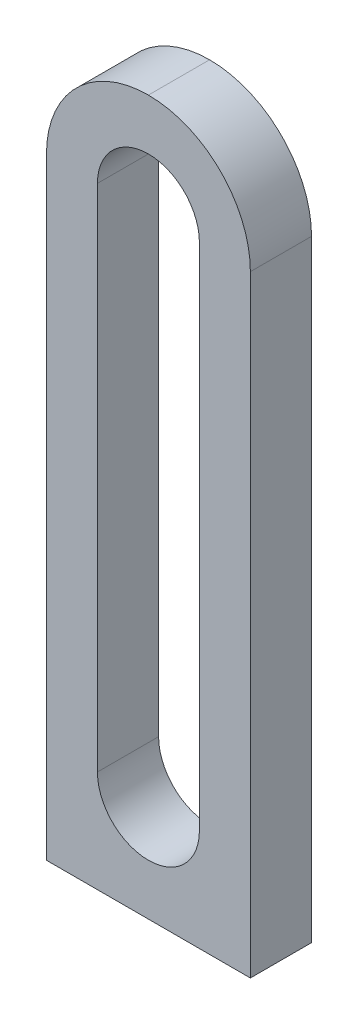
ISO-10303-21;
HEADER;
FILE_DESCRIPTION(('STEP AP214'),'2;1');
FILE_NAME('part.step','',(''),(''),'','','');
FILE_SCHEMA(('AUTOMOTIVE_DESIGN { 1 0 10303 214 1 1 1 1 }'));
ENDSEC;
DATA;
#1=APPLICATION_CONTEXT('core data for automotive mechanical design processes');
#2=APPLICATION_PROTOCOL_DEFINITION('international standard','automotive_design',2000,#1);
#3=PRODUCT_CONTEXT('',#1,'mechanical');
#4=PRODUCT('Part','Part','',(#3));
#5=PRODUCT_RELATED_PRODUCT_CATEGORY('part','',(#4));
#6=PRODUCT_DEFINITION_FORMATION('','',#4);
#7=PRODUCT_DEFINITION_CONTEXT('part definition',#1,'design');
#8=PRODUCT_DEFINITION('design','',#6,#7);
#9=PRODUCT_DEFINITION_SHAPE('','',#8);
#10=(LENGTH_UNIT() NAMED_UNIT(*) SI_UNIT(.MILLI.,.METRE.));
#11=(NAMED_UNIT(*) PLANE_ANGLE_UNIT() SI_UNIT($,.RADIAN.));
#12=(NAMED_UNIT(*) SI_UNIT($,.STERADIAN.) SOLID_ANGLE_UNIT());
#13=UNCERTAINTY_MEASURE_WITH_UNIT(LENGTH_MEASURE(1.E-05),#10,'distance_accuracy_value','');
#14=(GEOMETRIC_REPRESENTATION_CONTEXT(3) GLOBAL_UNCERTAINTY_ASSIGNED_CONTEXT((#13)) GLOBAL_UNIT_ASSIGNED_CONTEXT((#10,
#11,#12)) REPRESENTATION_CONTEXT('',''));
#15=CARTESIAN_POINT('',(0.,0.,0.));
#16=DIRECTION('',(0.,0.,1.));
#17=DIRECTION('',(1.,0.,0.));
#18=AXIS2_PLACEMENT_3D('',#15,#16,#17);
#19=CARTESIAN_POINT('',(4.99999999999999,-17.5,-3.));
#20=DIRECTION('',(1.,0.,0.));
#21=DIRECTION('',(0.,0.,-1.));
#22=AXIS2_PLACEMENT_3D('',#19,#20,#21);
#23=PLANE('',#22);
#24=DIRECTION('',(0.,1.,0.));
#25=VECTOR('',#24,1.);
#26=CARTESIAN_POINT('',(4.99999999999999,-17.5,-3.));
#27=LINE('',#26,#25);
#28=CARTESIAN_POINT('',(4.99999999999999,-17.5,-3.));
#29=VERTEX_POINT('',#28);
#30=CARTESIAN_POINT('',(4.99999999999999,12.5,-3.));
#31=VERTEX_POINT('',#30);
#32=EDGE_CURVE('E149',#29,#31,#27,.T.);
#33=ORIENTED_EDGE('',*,*,#32,.T.);
#34=DIRECTION('',(0.,0.,1.));
#35=VECTOR('',#34,1.);
#36=CARTESIAN_POINT('',(4.99999999999999,12.5,-3.));
#37=LINE('',#36,#35);
#38=CARTESIAN_POINT('',(4.99999999999999,12.5,0.));
#39=VERTEX_POINT('',#38);
#40=EDGE_CURVE('E11',#31,#39,#37,.T.);
#41=ORIENTED_EDGE('',*,*,#40,.T.);
#42=DIRECTION('',(0.,1.,0.));
#43=VECTOR('',#42,1.);
#44=CARTESIAN_POINT('',(4.99999999999999,-17.5,0.));
#45=LINE('',#44,#43);
#46=CARTESIAN_POINT('',(4.99999999999999,-17.5,0.));
#47=VERTEX_POINT('',#46);
#48=EDGE_CURVE('E145',#47,#39,#45,.T.);
#49=ORIENTED_EDGE('',*,*,#48,.F.);
#50=DIRECTION('',(0.,0.,1.));
#51=VECTOR('',#50,1.);
#52=CARTESIAN_POINT('',(4.99999999999999,-17.5,-3.));
#53=LINE('',#52,#51);
#54=EDGE_CURVE('E164',#29,#47,#53,.T.);
#55=ORIENTED_EDGE('',*,*,#54,.F.);
#56=EDGE_LOOP('',(#33,#41,#49,#55));
#57=FACE_BOUND('',#56,.T.);
#58=ADVANCED_FACE('F37',(#57),#23,.T.);
#59=CARTESIAN_POINT('',(-5.00000000000001,-17.5,-3.));
#60=DIRECTION('',(0.,-1.,0.));
#61=DIRECTION('',(0.,0.,-1.));
#62=AXIS2_PLACEMENT_3D('',#59,#60,#61);
#63=PLANE('',#62);
#64=DIRECTION('',(1.,0.,0.));
#65=VECTOR('',#64,1.);
#66=CARTESIAN_POINT('',(-5.00000000000001,-17.5,0.));
#67=LINE('',#66,#65);
#68=CARTESIAN_POINT('',(-5.00000000000001,-17.5,0.));
#69=VERTEX_POINT('',#68);
#70=EDGE_CURVE('E152',#69,#47,#67,.T.);
#71=ORIENTED_EDGE('',*,*,#70,.F.);
#72=DIRECTION('',(0.,0.,1.));
#73=VECTOR('',#72,1.);
#74=CARTESIAN_POINT('',(-5.00000000000001,-17.5,-3.));
#75=LINE('',#74,#73);
#76=CARTESIAN_POINT('',(-5.00000000000001,-17.5,-3.));
#77=VERTEX_POINT('',#76);
#78=EDGE_CURVE('E157',#77,#69,#75,.T.);
#79=ORIENTED_EDGE('',*,*,#78,.F.);
#80=DIRECTION('',(1.,0.,0.));
#81=VECTOR('',#80,1.);
#82=CARTESIAN_POINT('',(-5.00000000000001,-17.5,-3.));
#83=LINE('',#82,#81);
#84=EDGE_CURVE('E154',#77,#29,#83,.T.);
#85=ORIENTED_EDGE('',*,*,#84,.T.);
#86=ORIENTED_EDGE('',*,*,#54,.T.);
#87=EDGE_LOOP('',(#71,#79,#85,#86));
#88=FACE_BOUND('',#87,.T.);
#89=ADVANCED_FACE('F186',(#88),#63,.T.);
#90=CARTESIAN_POINT('',(-5.00000000000001,-17.5,-3.));
#91=DIRECTION('',(-1.,0.,0.));
#92=DIRECTION('',(0.,0.,1.));
#93=AXIS2_PLACEMENT_3D('',#90,#91,#92);
#94=PLANE('',#93);
#95=DIRECTION('',(0.,-1.,0.));
#96=VECTOR('',#95,1.);
#97=CARTESIAN_POINT('',(-5.00000000000001,-17.5,0.));
#98=LINE('',#97,#96);
#99=CARTESIAN_POINT('',(-5.00000000000001,12.5,0.));
#100=VERTEX_POINT('',#99);
#101=EDGE_CURVE('E160',#100,#69,#98,.T.);
#102=ORIENTED_EDGE('',*,*,#101,.F.);
#103=DIRECTION('',(0.,0.,1.));
#104=VECTOR('',#103,1.);
#105=CARTESIAN_POINT('',(-5.00000000000001,12.5,-3.));
#106=LINE('',#105,#104);
#107=CARTESIAN_POINT('',(-5.00000000000001,12.5,-3.));
#108=VERTEX_POINT('',#107);
#109=EDGE_CURVE('E172',#100,#108,#106,.F.);
#110=ORIENTED_EDGE('',*,*,#109,.T.);
#111=DIRECTION('',(0.,-1.,0.));
#112=VECTOR('',#111,1.);
#113=CARTESIAN_POINT('',(-5.00000000000001,-17.5,-3.));
#114=LINE('',#113,#112);
#115=EDGE_CURVE('E151',#108,#77,#114,.T.);
#116=ORIENTED_EDGE('',*,*,#115,.T.);
#117=ORIENTED_EDGE('',*,*,#78,.T.);
#118=EDGE_LOOP('',(#102,#110,#116,#117));
#119=FACE_BOUND('',#118,.T.);
#120=ADVANCED_FACE('F179',(#119),#94,.T.);
#121=CARTESIAN_POINT('',(0.,0.,-3.));
#122=DIRECTION('',(0.,0.,-1.));
#123=DIRECTION('',(-1.,0.,0.));
#124=AXIS2_PLACEMENT_3D('',#121,#122,#123);
#125=PLANE('',#124);
#126=CARTESIAN_POINT('',(0.,-12.5,-3.));
#127=DIRECTION('',(0.,0.,1.));
#128=DIRECTION('',(1.,0.,0.));
#129=AXIS2_PLACEMENT_3D('',#126,#127,#128);
#130=CIRCLE('',#129,2.5);
#131=CARTESIAN_POINT('',(-2.50000000000002,-12.5,-3.));
#132=VERTEX_POINT('',#131);
#133=CARTESIAN_POINT('',(2.49999999999999,-12.5,-3.));
#134=VERTEX_POINT('',#133);
#135=EDGE_CURVE('E110',#132,#134,#130,.T.);
#136=ORIENTED_EDGE('',*,*,#135,.T.);
#137=DIRECTION('',(0.,1.,0.));
#138=VECTOR('',#137,1.);
#139=CARTESIAN_POINT('',(2.49999999999999,-12.5,-3.));
#140=LINE('',#139,#138);
#141=CARTESIAN_POINT('',(2.49999999999999,12.5,-3.));
#142=VERTEX_POINT('',#141);
#143=EDGE_CURVE('E122',#134,#142,#140,.T.);
#144=ORIENTED_EDGE('',*,*,#143,.T.);
#145=CARTESIAN_POINT('',(0.,12.5,-3.));
#146=DIRECTION('',(0.,0.,1.));
#147=DIRECTION('',(1.,0.,0.));
#148=AXIS2_PLACEMENT_3D('',#145,#146,#147);
#149=CIRCLE('',#148,2.5);
#150=CARTESIAN_POINT('',(-2.50000000000002,12.5,-3.));
#151=VERTEX_POINT('',#150);
#152=EDGE_CURVE('E126',#142,#151,#149,.T.);
#153=ORIENTED_EDGE('',*,*,#152,.T.);
#154=DIRECTION('',(0.,-1.,0.));
#155=VECTOR('',#154,1.);
#156=CARTESIAN_POINT('',(-2.50000000000002,-12.5,-3.));
#157=LINE('',#156,#155);
#158=EDGE_CURVE('E118',#151,#132,#157,.T.);
#159=ORIENTED_EDGE('',*,*,#158,.T.);
#160=EDGE_LOOP('',(#136,#144,#153,#159));
#161=FACE_BOUND('',#160,.T.);
#162=ORIENTED_EDGE('',*,*,#115,.F.);
#163=CARTESIAN_POINT('',(0.,12.5,-3.));
#164=DIRECTION('',(0.,0.,-1.));
#165=DIRECTION('',(-1.,0.,0.));
#166=AXIS2_PLACEMENT_3D('',#163,#164,#165);
#167=CIRCLE('',#166,5.);
#168=CARTESIAN_POINT('',(0.,17.5,-3.));
#169=VERTEX_POINT('',#168);
#170=EDGE_CURVE('E46',#108,#169,#167,.T.);
#171=ORIENTED_EDGE('',*,*,#170,.T.);
#172=CARTESIAN_POINT('',(0.,12.5,-3.));
#173=DIRECTION('',(0.,0.,-1.));
#174=DIRECTION('',(-1.,0.,0.));
#175=AXIS2_PLACEMENT_3D('',#172,#173,#174);
#176=CIRCLE('',#175,5.);
#177=EDGE_CURVE('E56',#169,#31,#176,.T.);
#178=ORIENTED_EDGE('',*,*,#177,.T.);
#179=ORIENTED_EDGE('',*,*,#32,.F.);
#180=ORIENTED_EDGE('',*,*,#84,.F.);
#181=EDGE_LOOP('',(#162,#171,#178,#179,#180));
#182=FACE_BOUND('',#181,.T.);
#183=ADVANCED_FACE('F128',(#161,#182),#125,.T.);
#184=CARTESIAN_POINT('',(0.,0.,0.));
#185=DIRECTION('',(0.,0.,-1.));
#186=DIRECTION('',(-1.,0.,0.));
#187=AXIS2_PLACEMENT_3D('',#184,#185,#186);
#188=PLANE('',#187);
#189=DIRECTION('',(0.,1.,0.));
#190=VECTOR('',#189,1.);
#191=CARTESIAN_POINT('',(2.49999999999999,-12.5,0.));
#192=LINE('',#191,#190);
#193=CARTESIAN_POINT('',(2.49999999999999,-12.5,0.));
#194=VERTEX_POINT('',#193);
#195=CARTESIAN_POINT('',(2.49999999999999,12.5,0.));
#196=VERTEX_POINT('',#195);
#197=EDGE_CURVE('E139',#194,#196,#192,.T.);
#198=ORIENTED_EDGE('',*,*,#197,.F.);
#199=CARTESIAN_POINT('',(0.,-12.5,0.));
#200=DIRECTION('',(0.,0.,1.));
#201=DIRECTION('',(1.,0.,0.));
#202=AXIS2_PLACEMENT_3D('',#199,#200,#201);
#203=CIRCLE('',#202,2.5);
#204=CARTESIAN_POINT('',(-2.50000000000002,-12.5,0.));
#205=VERTEX_POINT('',#204);
#206=EDGE_CURVE('E113',#205,#194,#203,.T.);
#207=ORIENTED_EDGE('',*,*,#206,.F.);
#208=DIRECTION('',(0.,-1.,0.));
#209=VECTOR('',#208,1.);
#210=CARTESIAN_POINT('',(-2.50000000000002,-12.5,0.));
#211=LINE('',#210,#209);
#212=CARTESIAN_POINT('',(-2.50000000000002,12.5,0.));
#213=VERTEX_POINT('',#212);
#214=EDGE_CURVE('E130',#213,#205,#211,.T.);
#215=ORIENTED_EDGE('',*,*,#214,.F.);
#216=CARTESIAN_POINT('',(0.,12.5,0.));
#217=DIRECTION('',(0.,0.,1.));
#218=DIRECTION('',(1.,0.,0.));
#219=AXIS2_PLACEMENT_3D('',#216,#217,#218);
#220=CIRCLE('',#219,2.5);
#221=EDGE_CURVE('E133',#196,#213,#220,.T.);
#222=ORIENTED_EDGE('',*,*,#221,.F.);
#223=EDGE_LOOP('',(#198,#207,#215,#222));
#224=FACE_BOUND('',#223,.T.);
#225=CARTESIAN_POINT('',(0.,12.5,0.));
#226=DIRECTION('',(0.,0.,-1.));
#227=DIRECTION('',(-1.,0.,0.));
#228=AXIS2_PLACEMENT_3D('',#225,#226,#227);
#229=CIRCLE('',#228,5.);
#230=CARTESIAN_POINT('',(0.,17.5,0.));
#231=VERTEX_POINT('',#230);
#232=EDGE_CURVE('E166',#39,#231,#229,.F.);
#233=ORIENTED_EDGE('',*,*,#232,.T.);
#234=CARTESIAN_POINT('',(0.,12.5,0.));
#235=DIRECTION('',(0.,0.,-1.));
#236=DIRECTION('',(-1.,0.,0.));
#237=AXIS2_PLACEMENT_3D('',#234,#235,#236);
#238=CIRCLE('',#237,5.);
#239=EDGE_CURVE('E170',#231,#100,#238,.F.);
#240=ORIENTED_EDGE('',*,*,#239,.T.);
#241=ORIENTED_EDGE('',*,*,#101,.T.);
#242=ORIENTED_EDGE('',*,*,#70,.T.);
#243=ORIENTED_EDGE('',*,*,#48,.T.);
#244=EDGE_LOOP('',(#233,#240,#241,#242,#243));
#245=FACE_BOUND('',#244,.T.);
#246=ADVANCED_FACE('F189',(#224,#245),#188,.F.);
#247=CARTESIAN_POINT('',(0.,-12.5,-3.));
#248=DIRECTION('',(0.,0.,1.));
#249=DIRECTION('',(1.,0.,0.));
#250=AXIS2_PLACEMENT_3D('',#247,#248,#249);
#251=CYLINDRICAL_SURFACE('',#250,2.5);
#252=ORIENTED_EDGE('',*,*,#206,.T.);
#253=DIRECTION('',(0.,0.,1.));
#254=VECTOR('',#253,1.);
#255=CARTESIAN_POINT('',(2.49999999999999,-12.5,-3.));
#256=LINE('',#255,#254);
#257=EDGE_CURVE('E106',#134,#194,#256,.T.);
#258=ORIENTED_EDGE('',*,*,#257,.F.);
#259=ORIENTED_EDGE('',*,*,#135,.F.);
#260=DIRECTION('',(0.,0.,1.));
#261=VECTOR('',#260,1.);
#262=CARTESIAN_POINT('',(-2.50000000000002,-12.5,-3.));
#263=LINE('',#262,#261);
#264=EDGE_CURVE('E143',#132,#205,#263,.T.);
#265=ORIENTED_EDGE('',*,*,#264,.T.);
#266=EDGE_LOOP('',(#252,#258,#259,#265));
#267=FACE_BOUND('',#266,.T.);
#268=ADVANCED_FACE('F108',(#267),#251,.F.);
#269=CARTESIAN_POINT('',(-2.50000000000002,-12.5,-3.));
#270=DIRECTION('',(-1.,0.,0.));
#271=DIRECTION('',(0.,-1.,0.));
#272=AXIS2_PLACEMENT_3D('',#269,#270,#271);
#273=PLANE('',#272);
#274=ORIENTED_EDGE('',*,*,#214,.T.);
#275=ORIENTED_EDGE('',*,*,#264,.F.);
#276=ORIENTED_EDGE('',*,*,#158,.F.);
#277=DIRECTION('',(0.,0.,1.));
#278=VECTOR('',#277,1.);
#279=CARTESIAN_POINT('',(-2.50000000000002,12.5,-3.));
#280=LINE('',#279,#278);
#281=EDGE_CURVE('E146',#151,#213,#280,.T.);
#282=ORIENTED_EDGE('',*,*,#281,.T.);
#283=EDGE_LOOP('',(#274,#275,#276,#282));
#284=FACE_BOUND('',#283,.T.);
#285=ADVANCED_FACE('F216',(#284),#273,.F.);
#286=CARTESIAN_POINT('',(0.,12.5,-3.));
#287=DIRECTION('',(0.,0.,1.));
#288=DIRECTION('',(1.,0.,0.));
#289=AXIS2_PLACEMENT_3D('',#286,#287,#288);
#290=CYLINDRICAL_SURFACE('',#289,2.5);
#291=ORIENTED_EDGE('',*,*,#221,.T.);
#292=ORIENTED_EDGE('',*,*,#281,.F.);
#293=ORIENTED_EDGE('',*,*,#152,.F.);
#294=DIRECTION('',(0.,0.,1.));
#295=VECTOR('',#294,1.);
#296=CARTESIAN_POINT('',(2.49999999999999,12.5,-3.));
#297=LINE('',#296,#295);
#298=EDGE_CURVE('E117',#142,#196,#297,.T.);
#299=ORIENTED_EDGE('',*,*,#298,.T.);
#300=EDGE_LOOP('',(#291,#292,#293,#299));
#301=FACE_BOUND('',#300,.T.);
#302=ADVANCED_FACE('F211',(#301),#290,.F.);
#303=CARTESIAN_POINT('',(2.49999999999999,-12.5,-3.));
#304=DIRECTION('',(1.,0.,0.));
#305=DIRECTION('',(0.,1.,0.));
#306=AXIS2_PLACEMENT_3D('',#303,#304,#305);
#307=PLANE('',#306);
#308=ORIENTED_EDGE('',*,*,#197,.T.);
#309=ORIENTED_EDGE('',*,*,#298,.F.);
#310=ORIENTED_EDGE('',*,*,#143,.F.);
#311=ORIENTED_EDGE('',*,*,#257,.T.);
#312=EDGE_LOOP('',(#308,#309,#310,#311));
#313=FACE_BOUND('',#312,.T.);
#314=ADVANCED_FACE('F123',(#313),#307,.F.);
#315=CARTESIAN_POINT('',(0.,12.5,-3.));
#316=DIRECTION('',(0.,0.,1.));
#317=DIRECTION('',(1.,0.,0.));
#318=AXIS2_PLACEMENT_3D('',#315,#316,#317);
#319=CYLINDRICAL_SURFACE('',#318,5.);
#320=ORIENTED_EDGE('',*,*,#40,.F.);
#321=ORIENTED_EDGE('',*,*,#177,.F.);
#322=DIRECTION('',(0.,0.,1.));
#323=VECTOR('',#322,1.);
#324=CARTESIAN_POINT('',(0.,17.5,-3.));
#325=LINE('',#324,#323);
#326=EDGE_CURVE('E41',#231,#169,#325,.F.);
#327=ORIENTED_EDGE('',*,*,#326,.F.);
#328=ORIENTED_EDGE('',*,*,#232,.F.);
#329=EDGE_LOOP('',(#320,#321,#327,#328));
#330=FACE_BOUND('',#329,.T.);
#331=ADVANCED_FACE('F39',(#330),#319,.T.);
#332=CARTESIAN_POINT('',(0.,12.5,-3.));
#333=DIRECTION('',(0.,0.,1.));
#334=DIRECTION('',(1.,0.,0.));
#335=AXIS2_PLACEMENT_3D('',#332,#333,#334);
#336=CYLINDRICAL_SURFACE('',#335,5.);
#337=ORIENTED_EDGE('',*,*,#170,.F.);
#338=ORIENTED_EDGE('',*,*,#109,.F.);
#339=ORIENTED_EDGE('',*,*,#239,.F.);
#340=ORIENTED_EDGE('',*,*,#326,.T.);
#341=EDGE_LOOP('',(#337,#338,#339,#340));
#342=FACE_BOUND('',#341,.T.);
#343=ADVANCED_FACE('F193',(#342),#336,.T.);
#344=CLOSED_SHELL('',(#58,#89,#120,#183,#246,#268,#285,#302,#314,#331,#343));
#345=MANIFOLD_SOLID_BREP('B2',#344);
#346=ADVANCED_BREP_SHAPE_REPRESENTATION('',(#18,#345),#14);
#347=SHAPE_DEFINITION_REPRESENTATION(#9,#346);
ENDSEC;
END-ISO-10303-21;
